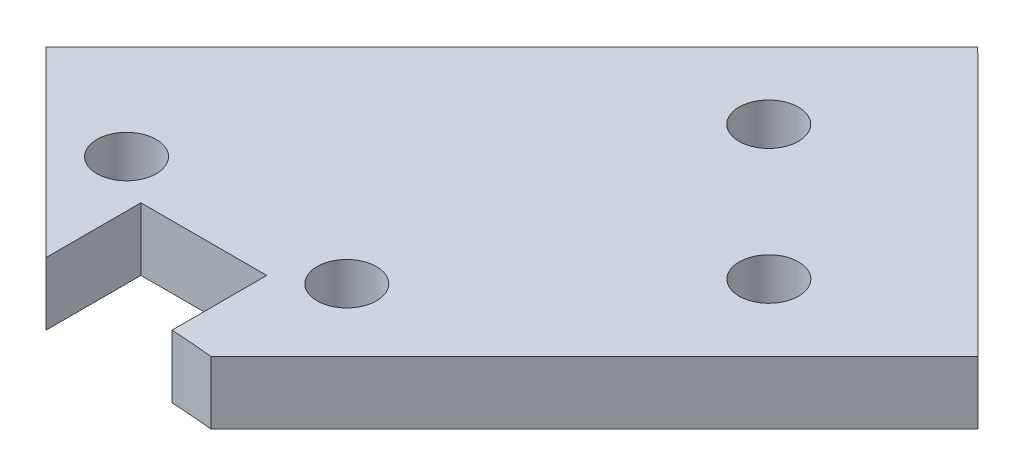
ISO-10303-21;
HEADER;
FILE_DESCRIPTION(('STEP AP214'),'2;1');
FILE_NAME('part.step','',(''),(''),'','','');
FILE_SCHEMA(('AUTOMOTIVE_DESIGN { 1 0 10303 214 1 1 1 1 }'));
ENDSEC;
DATA;
#1=APPLICATION_CONTEXT('core data for automotive mechanical design processes');
#2=APPLICATION_PROTOCOL_DEFINITION('international standard','automotive_design',2000,#1);
#3=PRODUCT_CONTEXT('',#1,'mechanical');
#4=PRODUCT('Part','Part','',(#3));
#5=PRODUCT_RELATED_PRODUCT_CATEGORY('part','',(#4));
#6=PRODUCT_DEFINITION_FORMATION('','',#4);
#7=PRODUCT_DEFINITION_CONTEXT('part definition',#1,'design');
#8=PRODUCT_DEFINITION('design','',#6,#7);
#9=PRODUCT_DEFINITION_SHAPE('','',#8);
#10=(LENGTH_UNIT() NAMED_UNIT(*) SI_UNIT(.MILLI.,.METRE.));
#11=(NAMED_UNIT(*) PLANE_ANGLE_UNIT() SI_UNIT($,.RADIAN.));
#12=(NAMED_UNIT(*) SI_UNIT($,.STERADIAN.) SOLID_ANGLE_UNIT());
#13=UNCERTAINTY_MEASURE_WITH_UNIT(LENGTH_MEASURE(1.E-05),#10,'distance_accuracy_value','');
#14=(GEOMETRIC_REPRESENTATION_CONTEXT(3) GLOBAL_UNCERTAINTY_ASSIGNED_CONTEXT((#13)) GLOBAL_UNIT_ASSIGNED_CONTEXT((#10,
#11,#12)) REPRESENTATION_CONTEXT('',''));
#15=CARTESIAN_POINT('',(0.,0.,0.));
#16=DIRECTION('',(0.,0.,1.));
#17=DIRECTION('',(1.,0.,0.));
#18=AXIS2_PLACEMENT_3D('',#15,#16,#17);
#19=CARTESIAN_POINT('',(5.55625,3.175,-61.346730494));
#20=DIRECTION('',(0.,-1.,0.));
#21=DIRECTION('',(0.,0.,-1.));
#22=AXIS2_PLACEMENT_3D('',#19,#20,#21);
#23=CYLINDRICAL_SURFACE('',#22,1.5);
#24=CARTESIAN_POINT('',(5.55625,3.175,-61.346730494));
#25=DIRECTION('',(0.,1.,0.));
#26=DIRECTION('',(0.,0.,1.));
#27=AXIS2_PLACEMENT_3D('',#24,#25,#26);
#28=CIRCLE('',#27,1.5);
#29=CARTESIAN_POINT('',(5.55625,3.175,-59.846730494));
#30=VERTEX_POINT('',#29);
#31=EDGE_CURVE('E176',#30,#30,#28,.T.);
#32=ORIENTED_EDGE('',*,*,#31,.T.);
#33=EDGE_LOOP('',(#32));
#34=FACE_BOUND('',#33,.T.);
#35=CARTESIAN_POINT('',(5.55625,0.,-61.346730494));
#36=DIRECTION('',(0.,1.,0.));
#37=DIRECTION('',(0.,0.,1.));
#38=AXIS2_PLACEMENT_3D('',#35,#36,#37);
#39=CIRCLE('',#38,1.5);
#40=CARTESIAN_POINT('',(5.55625,0.,-59.846730494));
#41=VERTEX_POINT('',#40);
#42=EDGE_CURVE('E134',#41,#41,#39,.T.);
#43=ORIENTED_EDGE('',*,*,#42,.F.);
#44=EDGE_LOOP('',(#43));
#45=FACE_BOUND('',#44,.T.);
#46=ADVANCED_FACE('F41',(#34,#45),#23,.F.);
#47=CARTESIAN_POINT('',(-5.55625,3.175,-61.346730494));
#48=DIRECTION('',(0.,-1.,0.));
#49=DIRECTION('',(0.,0.,-1.));
#50=AXIS2_PLACEMENT_3D('',#47,#48,#49);
#51=CYLINDRICAL_SURFACE('',#50,1.5);
#52=CARTESIAN_POINT('',(-5.55625,3.175,-61.346730494));
#53=DIRECTION('',(0.,1.,0.));
#54=DIRECTION('',(0.,0.,1.));
#55=AXIS2_PLACEMENT_3D('',#52,#53,#54);
#56=CIRCLE('',#55,1.5);
#57=CARTESIAN_POINT('',(-5.55625,3.175,-59.846730494));
#58=VERTEX_POINT('',#57);
#59=EDGE_CURVE('E173',#58,#58,#56,.T.);
#60=ORIENTED_EDGE('',*,*,#59,.T.);
#61=EDGE_LOOP('',(#60));
#62=FACE_BOUND('',#61,.T.);
#63=CARTESIAN_POINT('',(-5.55625,0.,-61.346730494));
#64=DIRECTION('',(0.,1.,0.));
#65=DIRECTION('',(0.,0.,1.));
#66=AXIS2_PLACEMENT_3D('',#63,#64,#65);
#67=CIRCLE('',#66,1.5);
#68=CARTESIAN_POINT('',(-5.55625,0.,-59.846730494));
#69=VERTEX_POINT('',#68);
#70=EDGE_CURVE('E128',#69,#69,#67,.T.);
#71=ORIENTED_EDGE('',*,*,#70,.F.);
#72=EDGE_LOOP('',(#71));
#73=FACE_BOUND('',#72,.T.);
#74=ADVANCED_FACE('F202',(#62,#73),#51,.F.);
#75=CARTESIAN_POINT('',(3.175,0.,-53.34));
#76=DIRECTION('',(1.,0.,0.));
#77=DIRECTION('',(0.,0.,-1.));
#78=AXIS2_PLACEMENT_3D('',#75,#76,#77);
#79=PLANE('',#78);
#80=DIRECTION('',(0.,-1.,0.));
#81=VECTOR('',#80,1.);
#82=CARTESIAN_POINT('',(3.175,3.175,-54.9082814792086));
#83=LINE('',#82,#81);
#84=CARTESIAN_POINT('',(3.175,0.,-54.9082814792086));
#85=VERTEX_POINT('',#84);
#86=CARTESIAN_POINT('',(3.175,3.175,-54.9082814792086));
#87=VERTEX_POINT('',#86);
#88=EDGE_CURVE('E137',#85,#87,#83,.F.);
#89=ORIENTED_EDGE('',*,*,#88,.T.);
#90=DIRECTION('',(0.,0.,-1.));
#91=VECTOR('',#90,1.);
#92=CARTESIAN_POINT('',(3.175,3.175,-53.34));
#93=LINE('',#92,#91);
#94=CARTESIAN_POINT('',(3.175,3.175,-59.69));
#95=VERTEX_POINT('',#94);
#96=EDGE_CURVE('E269',#87,#95,#93,.T.);
#97=ORIENTED_EDGE('',*,*,#96,.T.);
#98=DIRECTION('',(0.,1.,0.));
#99=VECTOR('',#98,1.);
#100=CARTESIAN_POINT('',(3.175,0.,-59.69));
#101=LINE('',#100,#99);
#102=CARTESIAN_POINT('',(3.175,0.,-59.69));
#103=VERTEX_POINT('',#102);
#104=EDGE_CURVE('E167',#103,#95,#101,.T.);
#105=ORIENTED_EDGE('',*,*,#104,.F.);
#106=DIRECTION('',(0.,0.,-1.));
#107=VECTOR('',#106,1.);
#108=CARTESIAN_POINT('',(3.175,0.,0.));
#109=LINE('',#108,#107);
#110=EDGE_CURVE('E150',#85,#103,#109,.T.);
#111=ORIENTED_EDGE('',*,*,#110,.F.);
#112=EDGE_LOOP('',(#89,#97,#105,#111));
#113=FACE_BOUND('',#112,.T.);
#114=ADVANCED_FACE('F207',(#113),#79,.F.);
#115=CARTESIAN_POINT('',(0.,3.175,0.));
#116=DIRECTION('',(0.,-1.,0.));
#117=DIRECTION('',(0.,0.,-1.));
#118=AXIS2_PLACEMENT_3D('',#115,#116,#117);
#119=CYLINDRICAL_SURFACE('',#118,55.);
#120=DIRECTION('',(0.,1.,0.));
#121=VECTOR('',#120,1.);
#122=CARTESIAN_POINT('',(5.32191909351782,-6.825,-54.7419142628576));
#123=LINE('',#122,#121);
#124=CARTESIAN_POINT('',(5.32191909351782,0.,-54.7419142628576));
#125=VERTEX_POINT('',#124);
#126=CARTESIAN_POINT('',(5.32191909351782,3.175,-54.7419142628576));
#127=VERTEX_POINT('',#126);
#128=EDGE_CURVE('E64',#125,#127,#123,.T.);
#129=ORIENTED_EDGE('',*,*,#128,.T.);
#130=CARTESIAN_POINT('',(0.,3.175,0.));
#131=DIRECTION('',(0.,1.,0.));
#132=DIRECTION('',(0.,0.,1.));
#133=AXIS2_PLACEMENT_3D('',#130,#131,#132);
#134=CIRCLE('',#133,55.);
#135=EDGE_CURVE('E140',#127,#87,#134,.T.);
#136=ORIENTED_EDGE('',*,*,#135,.T.);
#137=ORIENTED_EDGE('',*,*,#88,.F.);
#138=CARTESIAN_POINT('',(0.,0.,0.));
#139=DIRECTION('',(0.,1.,0.));
#140=DIRECTION('',(0.,0.,1.));
#141=AXIS2_PLACEMENT_3D('',#138,#139,#140);
#142=CIRCLE('',#141,55.);
#143=EDGE_CURVE('E146',#125,#85,#142,.T.);
#144=ORIENTED_EDGE('',*,*,#143,.F.);
#145=EDGE_LOOP('',(#129,#136,#137,#144));
#146=FACE_BOUND('',#145,.T.);
#147=ADVANCED_FACE('F158',(#146),#119,.F.);
#148=CARTESIAN_POINT('',(-24.7074527961177,-6.825,-24.683950278017));
#149=DIRECTION('',(-0.707443172401365,0.,-0.706770229864482));
#150=DIRECTION('',(-0.706770229864482,0.,0.707443172401365));
#151=AXIS2_PLACEMENT_3D('',#148,#149,#150);
#152=PLANE('',#151);
#153=DIRECTION('',(0.,1.,0.));
#154=VECTOR('',#153,1.);
#155=CARTESIAN_POINT('',(24.6604477599164,-6.825,-74.0988558702524));
#156=LINE('',#155,#154);
#157=CARTESIAN_POINT('',(24.6604477599164,0.,-74.0988558702524));
#158=VERTEX_POINT('',#157);
#159=CARTESIAN_POINT('',(24.6604477599164,3.175,-74.0988558702524));
#160=VERTEX_POINT('',#159);
#161=EDGE_CURVE('E126',#158,#160,#156,.T.);
#162=ORIENTED_EDGE('',*,*,#161,.T.);
#163=DIRECTION('',(-0.706770229864482,0.,0.707443172401365));
#164=VECTOR('',#163,1.);
#165=CARTESIAN_POINT('',(-24.7074527961177,3.175,-24.683950278017));
#166=LINE('',#165,#164);
#167=EDGE_CURVE('E261',#160,#127,#166,.T.);
#168=ORIENTED_EDGE('',*,*,#167,.T.);
#169=ORIENTED_EDGE('',*,*,#128,.F.);
#170=DIRECTION('',(-0.706770229864482,0.,0.707443172401365));
#171=VECTOR('',#170,1.);
#172=CARTESIAN_POINT('',(-24.7074527961177,0.,-24.683950278017));
#173=LINE('',#172,#171);
#174=EDGE_CURVE('E50',#158,#125,#173,.T.);
#175=ORIENTED_EDGE('',*,*,#174,.F.);
#176=EDGE_LOOP('',(#162,#168,#169,#175));
#177=FACE_BOUND('',#176,.T.);
#178=ADVANCED_FACE('F211',(#177),#152,.F.);
#179=CARTESIAN_POINT('',(49.3679005560341,3.175,-49.4149055922353));
#180=DIRECTION('',(-0.706770229864482,0.,0.707443172401365));
#181=DIRECTION('',(0.707443172401365,0.,0.706770229864482));
#182=AXIS2_PLACEMENT_3D('',#179,#180,#181);
#183=PLANE('',#182);
#184=DIRECTION('',(-0.707443172401365,0.,-0.706770229864482));
#185=VECTOR('',#184,1.);
#186=CARTESIAN_POINT('',(49.3679005560341,0.,-49.4149055922353));
#187=LINE('',#186,#185);
#188=CARTESIAN_POINT('',(11.12169927642,0.,-87.6247258638486));
#189=VERTEX_POINT('',#188);
#190=EDGE_CURVE('E120',#158,#189,#187,.T.);
#191=ORIENTED_EDGE('',*,*,#190,.T.);
#192=DIRECTION('',(0.,1.,0.));
#193=VECTOR('',#192,1.);
#194=CARTESIAN_POINT('',(11.12169927642,0.,-87.6247258638486));
#195=LINE('',#194,#193);
#196=CARTESIAN_POINT('',(11.12169927642,3.175,-87.6247258638486));
#197=VERTEX_POINT('',#196);
#198=EDGE_CURVE('E104',#189,#197,#195,.T.);
#199=ORIENTED_EDGE('',*,*,#198,.T.);
#200=DIRECTION('',(-0.707443172401365,0.,-0.706770229864482));
#201=VECTOR('',#200,1.);
#202=CARTESIAN_POINT('',(49.3679005560341,3.175,-49.4149055922353));
#203=LINE('',#202,#201);
#204=EDGE_CURVE('E149',#160,#197,#203,.T.);
#205=ORIENTED_EDGE('',*,*,#204,.F.);
#206=ORIENTED_EDGE('',*,*,#161,.F.);
#207=EDGE_LOOP('',(#191,#199,#205,#206));
#208=FACE_BOUND('',#207,.T.);
#209=ADVANCED_FACE('F43',(#208),#183,.F.);
#210=CARTESIAN_POINT('',(3.175,0.,-59.69));
#211=DIRECTION('',(0.,0.,-1.));
#212=DIRECTION('',(-1.,0.,0.));
#213=AXIS2_PLACEMENT_3D('',#210,#211,#212);
#214=PLANE('',#213);
#215=DIRECTION('',(-1.,0.,0.));
#216=VECTOR('',#215,1.);
#217=CARTESIAN_POINT('',(3.175,3.175,-59.69));
#218=LINE('',#217,#216);
#219=CARTESIAN_POINT('',(-3.175,3.175,-59.69));
#220=VERTEX_POINT('',#219);
#221=EDGE_CURVE('E282',#95,#220,#218,.T.);
#222=ORIENTED_EDGE('',*,*,#221,.T.);
#223=DIRECTION('',(0.,1.,0.));
#224=VECTOR('',#223,1.);
#225=CARTESIAN_POINT('',(-3.175,0.,-59.69));
#226=LINE('',#225,#224);
#227=CARTESIAN_POINT('',(-3.175,0.,-59.69));
#228=VERTEX_POINT('',#227);
#229=EDGE_CURVE('E164',#228,#220,#226,.T.);
#230=ORIENTED_EDGE('',*,*,#229,.F.);
#231=DIRECTION('',(-1.,0.,0.));
#232=VECTOR('',#231,1.);
#233=CARTESIAN_POINT('',(3.175,0.,-59.69));
#234=LINE('',#233,#232);
#235=EDGE_CURVE('E272',#103,#228,#234,.T.);
#236=ORIENTED_EDGE('',*,*,#235,.F.);
#237=ORIENTED_EDGE('',*,*,#104,.T.);
#238=EDGE_LOOP('',(#222,#230,#236,#237));
#239=FACE_BOUND('',#238,.T.);
#240=ADVANCED_FACE('F220',(#239),#214,.F.);
#241=CARTESIAN_POINT('',(-3.175,0.,-53.34));
#242=DIRECTION('',(-1.,0.,0.));
#243=DIRECTION('',(0.,0.,1.));
#244=AXIS2_PLACEMENT_3D('',#241,#242,#243);
#245=PLANE('',#244);
#246=DIRECTION('',(0.,-1.,0.));
#247=VECTOR('',#246,1.);
#248=CARTESIAN_POINT('',(-3.175,3.175,-54.9082814792086));
#249=LINE('',#248,#247);
#250=CARTESIAN_POINT('',(-3.175,3.175,-54.9082814792086));
#251=VERTEX_POINT('',#250);
#252=CARTESIAN_POINT('',(-3.175,0.,-54.9082814792086));
#253=VERTEX_POINT('',#252);
#254=EDGE_CURVE('E129',#251,#253,#249,.T.);
#255=ORIENTED_EDGE('',*,*,#254,.T.);
#256=DIRECTION('',(0.,0.,1.));
#257=VECTOR('',#256,1.);
#258=CARTESIAN_POINT('',(-3.175,0.,-59.69));
#259=LINE('',#258,#257);
#260=EDGE_CURVE('E276',#228,#253,#259,.T.);
#261=ORIENTED_EDGE('',*,*,#260,.F.);
#262=ORIENTED_EDGE('',*,*,#229,.T.);
#263=DIRECTION('',(0.,0.,1.));
#264=VECTOR('',#263,1.);
#265=CARTESIAN_POINT('',(-3.175,3.175,-53.34));
#266=LINE('',#265,#264);
#267=EDGE_CURVE('E277',#220,#251,#266,.T.);
#268=ORIENTED_EDGE('',*,*,#267,.T.);
#269=EDGE_LOOP('',(#255,#261,#262,#268));
#270=FACE_BOUND('',#269,.T.);
#271=ADVANCED_FACE('F195',(#270),#245,.F.);
#272=CARTESIAN_POINT('',(0.,0.,0.));
#273=DIRECTION('',(0.,1.,0.));
#274=DIRECTION('',(0.,0.,1.));
#275=AXIS2_PLACEMENT_3D('',#272,#273,#274);
#276=PLANE('',#275);
#277=CARTESIAN_POINT('',(16.002609238627,0.,-72.2021512023198));
#278=DIRECTION('',(0.,1.,0.));
#279=DIRECTION('',(0.,0.,1.));
#280=AXIS2_PLACEMENT_3D('',#277,#278,#279);
#281=CIRCLE('',#280,1.49999999999999);
#282=CARTESIAN_POINT('',(16.002609238627,0.,-70.7021512023198));
#283=VERTEX_POINT('',#282);
#284=EDGE_CURVE('E241',#283,#283,#281,.F.);
#285=ORIENTED_EDGE('',*,*,#284,.F.);
#286=EDGE_LOOP('',(#285));
#287=FACE_BOUND('',#286,.T.);
#288=CARTESIAN_POINT('',(9.23323499687884,0.,-78.9650861991179));
#289=DIRECTION('',(0.,1.,0.));
#290=DIRECTION('',(0.,0.,1.));
#291=AXIS2_PLACEMENT_3D('',#288,#289,#290);
#292=CIRCLE('',#291,1.5);
#293=CARTESIAN_POINT('',(9.23323499687884,0.,-77.4650861991179));
#294=VERTEX_POINT('',#293);
#295=EDGE_CURVE('E245',#294,#294,#292,.F.);
#296=ORIENTED_EDGE('',*,*,#295,.F.);
#297=EDGE_LOOP('',(#296));
#298=FACE_BOUND('',#297,.T.);
#299=DIRECTION('',(-0.707443172401365,0.,-0.706770229864482));
#300=VECTOR('',#299,1.);
#301=CARTESIAN_POINT('',(-3.175,0.,-54.9082814792086));
#302=LINE('',#301,#300);
#303=CARTESIAN_POINT('',(-12.37806217375,0.,-64.1025894063308));
#304=VERTEX_POINT('',#303);
#305=EDGE_CURVE('E122',#253,#304,#302,.T.);
#306=ORIENTED_EDGE('',*,*,#305,.T.);
#307=DIRECTION('',(0.706770229864482,0.,-0.707443172401365));
#308=VECTOR('',#307,1.);
#309=CARTESIAN_POINT('',(11.12169927642,0.,-87.6247258638486));
#310=LINE('',#309,#308);
#311=EDGE_CURVE('E57',#304,#189,#310,.T.);
#312=ORIENTED_EDGE('',*,*,#311,.T.);
#313=ORIENTED_EDGE('',*,*,#190,.F.);
#314=ORIENTED_EDGE('',*,*,#174,.T.);
#315=ORIENTED_EDGE('',*,*,#143,.T.);
#316=ORIENTED_EDGE('',*,*,#110,.T.);
#317=ORIENTED_EDGE('',*,*,#235,.T.);
#318=ORIENTED_EDGE('',*,*,#260,.T.);
#319=EDGE_LOOP('',(#306,#312,#313,#314,#315,#316,#317,#318));
#320=FACE_BOUND('',#319,.T.);
#321=ORIENTED_EDGE('',*,*,#70,.T.);
#322=EDGE_LOOP('',(#321));
#323=FACE_BOUND('',#322,.T.);
#324=ORIENTED_EDGE('',*,*,#42,.T.);
#325=EDGE_LOOP('',(#324));
#326=FACE_BOUND('',#325,.T.);
#327=ADVANCED_FACE('F118',(#287,#298,#320,#323,#326),#276,.F.);
#328=CARTESIAN_POINT('',(0.,3.175,0.));
#329=DIRECTION('',(0.,1.,0.));
#330=DIRECTION('',(0.,0.,1.));
#331=AXIS2_PLACEMENT_3D('',#328,#329,#330);
#332=PLANE('',#331);
#333=CARTESIAN_POINT('',(16.002609238627,3.175,-72.2021512023198));
#334=DIRECTION('',(0.,1.,0.));
#335=DIRECTION('',(0.,0.,1.));
#336=AXIS2_PLACEMENT_3D('',#333,#334,#335);
#337=CIRCLE('',#336,1.49999999999999);
#338=CARTESIAN_POINT('',(16.002609238627,3.175,-70.7021512023198));
#339=VERTEX_POINT('',#338);
#340=EDGE_CURVE('E243',#339,#339,#337,.F.);
#341=ORIENTED_EDGE('',*,*,#340,.T.);
#342=EDGE_LOOP('',(#341));
#343=FACE_BOUND('',#342,.T.);
#344=CARTESIAN_POINT('',(9.23323499687884,3.175,-78.9650861991179));
#345=DIRECTION('',(0.,1.,0.));
#346=DIRECTION('',(0.,0.,1.));
#347=AXIS2_PLACEMENT_3D('',#344,#345,#346);
#348=CIRCLE('',#347,1.5);
#349=CARTESIAN_POINT('',(9.23323499687884,3.175,-77.4650861991179));
#350=VERTEX_POINT('',#349);
#351=EDGE_CURVE('E251',#350,#350,#348,.F.);
#352=ORIENTED_EDGE('',*,*,#351,.T.);
#353=EDGE_LOOP('',(#352));
#354=FACE_BOUND('',#353,.T.);
#355=DIRECTION('',(0.706770229864482,0.,-0.707443172401365));
#356=VECTOR('',#355,1.);
#357=CARTESIAN_POINT('',(11.12169927642,3.175,-87.6247258638486));
#358=LINE('',#357,#356);
#359=CARTESIAN_POINT('',(-12.37806217375,3.175,-64.1025894063308));
#360=VERTEX_POINT('',#359);
#361=EDGE_CURVE('E107',#360,#197,#358,.T.);
#362=ORIENTED_EDGE('',*,*,#361,.F.);
#363=DIRECTION('',(-0.707443172401365,0.,-0.706770229864482));
#364=VECTOR('',#363,1.);
#365=CARTESIAN_POINT('',(-3.175,3.175,-54.9082814792086));
#366=LINE('',#365,#364);
#367=EDGE_CURVE('E113',#251,#360,#366,.T.);
#368=ORIENTED_EDGE('',*,*,#367,.F.);
#369=ORIENTED_EDGE('',*,*,#267,.F.);
#370=ORIENTED_EDGE('',*,*,#221,.F.);
#371=ORIENTED_EDGE('',*,*,#96,.F.);
#372=ORIENTED_EDGE('',*,*,#135,.F.);
#373=ORIENTED_EDGE('',*,*,#167,.F.);
#374=ORIENTED_EDGE('',*,*,#204,.T.);
#375=EDGE_LOOP('',(#362,#368,#369,#370,#371,#372,#373,#374));
#376=FACE_BOUND('',#375,.T.);
#377=ORIENTED_EDGE('',*,*,#59,.F.);
#378=EDGE_LOOP('',(#377));
#379=FACE_BOUND('',#378,.T.);
#380=ORIENTED_EDGE('',*,*,#31,.F.);
#381=EDGE_LOOP('',(#380));
#382=FACE_BOUND('',#381,.T.);
#383=ADVANCED_FACE('F184',(#343,#354,#376,#379,#382),#332,.T.);
#384=CARTESIAN_POINT('',(-3.175,0.,-54.9082814792086));
#385=DIRECTION('',(0.706770229864482,0.,-0.707443172401365));
#386=DIRECTION('',(-0.707443172401365,0.,-0.706770229864482));
#387=AXIS2_PLACEMENT_3D('',#384,#385,#386);
#388=PLANE('',#387);
#389=ORIENTED_EDGE('',*,*,#367,.T.);
#390=DIRECTION('',(0.,-1.,0.));
#391=VECTOR('',#390,1.);
#392=CARTESIAN_POINT('',(-12.37806217375,0.,-64.1025894063308));
#393=LINE('',#392,#391);
#394=EDGE_CURVE('E11',#360,#304,#393,.T.);
#395=ORIENTED_EDGE('',*,*,#394,.T.);
#396=ORIENTED_EDGE('',*,*,#305,.F.);
#397=ORIENTED_EDGE('',*,*,#254,.F.);
#398=EDGE_LOOP('',(#389,#395,#396,#397));
#399=FACE_BOUND('',#398,.T.);
#400=ADVANCED_FACE('F186',(#399),#388,.F.);
#401=CARTESIAN_POINT('',(11.12169927642,0.,-87.6247258638486));
#402=DIRECTION('',(0.707443172401365,0.,0.706770229864482));
#403=DIRECTION('',(0.706770229864482,0.,-0.707443172401365));
#404=AXIS2_PLACEMENT_3D('',#401,#402,#403);
#405=PLANE('',#404);
#406=ORIENTED_EDGE('',*,*,#361,.T.);
#407=ORIENTED_EDGE('',*,*,#198,.F.);
#408=ORIENTED_EDGE('',*,*,#311,.F.);
#409=ORIENTED_EDGE('',*,*,#394,.F.);
#410=EDGE_LOOP('',(#406,#407,#408,#409));
#411=FACE_BOUND('',#410,.T.);
#412=ADVANCED_FACE('F105',(#411),#405,.F.);
#413=CARTESIAN_POINT('',(9.23323499687884,0.,-78.9650861991179));
#414=DIRECTION('',(0.,1.,0.));
#415=DIRECTION('',(0.,0.,1.));
#416=AXIS2_PLACEMENT_3D('',#413,#414,#415);
#417=CYLINDRICAL_SURFACE('',#416,1.5);
#418=ORIENTED_EDGE('',*,*,#295,.T.);
#419=EDGE_LOOP('',(#418));
#420=FACE_BOUND('',#419,.T.);
#421=ORIENTED_EDGE('',*,*,#351,.F.);
#422=EDGE_LOOP('',(#421));
#423=FACE_BOUND('',#422,.T.);
#424=ADVANCED_FACE('F229',(#420,#423),#417,.F.);
#425=CARTESIAN_POINT('',(16.002609238627,0.,-72.2021512023198));
#426=DIRECTION('',(0.,1.,0.));
#427=DIRECTION('',(0.,0.,1.));
#428=AXIS2_PLACEMENT_3D('',#425,#426,#427);
#429=CYLINDRICAL_SURFACE('',#428,1.49999999999999);
#430=ORIENTED_EDGE('',*,*,#284,.T.);
#431=EDGE_LOOP('',(#430));
#432=FACE_BOUND('',#431,.T.);
#433=ORIENTED_EDGE('',*,*,#340,.F.);
#434=EDGE_LOOP('',(#433));
#435=FACE_BOUND('',#434,.T.);
#436=ADVANCED_FACE('F232',(#432,#435),#429,.F.);
#437=CLOSED_SHELL('',(#46,#74,#114,#147,#178,#209,#240,#271,#327,#383,#400,#412,#424,#436));
#438=MANIFOLD_SOLID_BREP('B2',#437);
#439=ADVANCED_BREP_SHAPE_REPRESENTATION('',(#18,#438),#14);
#440=SHAPE_DEFINITION_REPRESENTATION(#9,#439);
ENDSEC;
END-ISO-10303-21;
